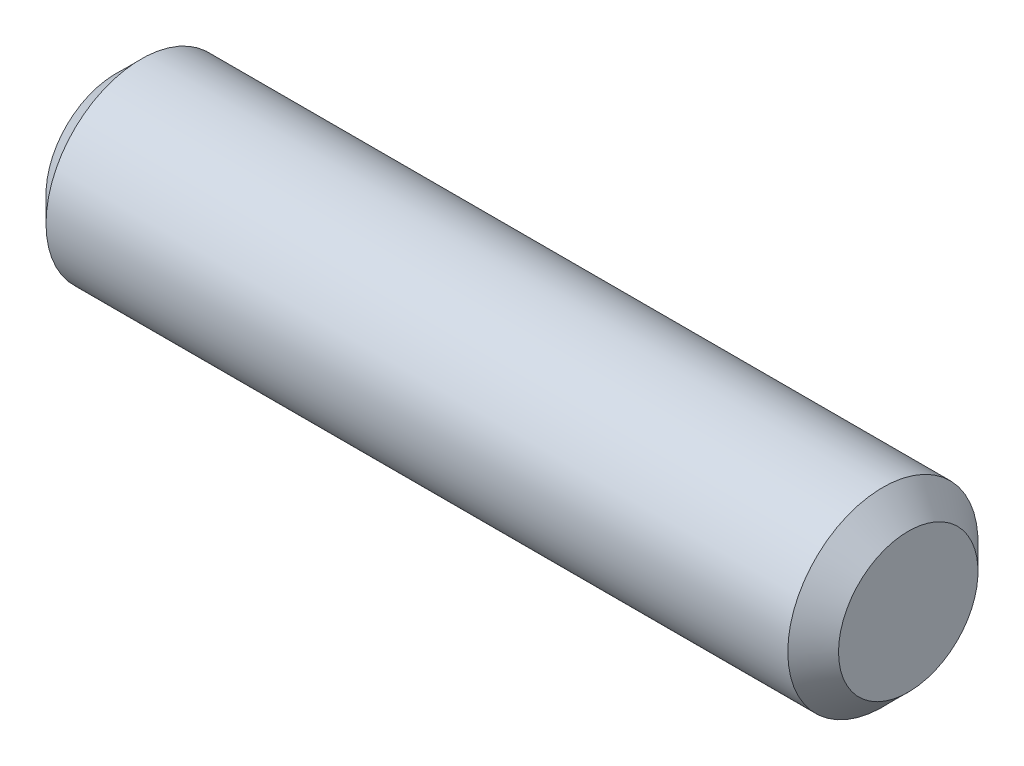
ISO-10303-21;
HEADER;
FILE_DESCRIPTION(('STEP AP214'),'2;1');
FILE_NAME('part.step','',(''),(''),'','','');
FILE_SCHEMA(('AUTOMOTIVE_DESIGN { 1 0 10303 214 1 1 1 1 }'));
ENDSEC;
DATA;
#1=APPLICATION_CONTEXT('core data for automotive mechanical design processes');
#2=APPLICATION_PROTOCOL_DEFINITION('international standard','automotive_design',2000,#1);
#3=PRODUCT_CONTEXT('',#1,'mechanical');
#4=PRODUCT('Part','Part','',(#3));
#5=PRODUCT_RELATED_PRODUCT_CATEGORY('part','',(#4));
#6=PRODUCT_DEFINITION_FORMATION('','',#4);
#7=PRODUCT_DEFINITION_CONTEXT('part definition',#1,'design');
#8=PRODUCT_DEFINITION('design','',#6,#7);
#9=PRODUCT_DEFINITION_SHAPE('','',#8);
#10=(LENGTH_UNIT() NAMED_UNIT(*) SI_UNIT(.MILLI.,.METRE.));
#11=(NAMED_UNIT(*) PLANE_ANGLE_UNIT() SI_UNIT($,.RADIAN.));
#12=(NAMED_UNIT(*) SI_UNIT($,.STERADIAN.) SOLID_ANGLE_UNIT());
#13=UNCERTAINTY_MEASURE_WITH_UNIT(LENGTH_MEASURE(1.E-05),#10,'distance_accuracy_value','');
#14=(GEOMETRIC_REPRESENTATION_CONTEXT(3) GLOBAL_UNCERTAINTY_ASSIGNED_CONTEXT((#13)) GLOBAL_UNIT_ASSIGNED_CONTEXT((#10,
#11,#12)) REPRESENTATION_CONTEXT('',''));
#15=CARTESIAN_POINT('',(0.,0.,0.));
#16=DIRECTION('',(0.,0.,1.));
#17=DIRECTION('',(1.,0.,0.));
#18=AXIS2_PLACEMENT_3D('',#15,#16,#17);
#19=CARTESIAN_POINT('',(-5.34269662921348,0.,0.));
#20=DIRECTION('',(1.,0.,0.));
#21=DIRECTION('',(0.,0.,-1.));
#22=AXIS2_PLACEMENT_3D('',#19,#20,#21);
#23=PLANE('',#22);
#24=CARTESIAN_POINT('',(-5.34269662921348,0.,0.));
#25=DIRECTION('',(1.,0.,0.));
#26=DIRECTION('',(0.,0.,-1.));
#27=AXIS2_PLACEMENT_3D('',#24,#25,#26);
#28=CIRCLE('',#27,2.2);
#29=CARTESIAN_POINT('',(-5.34269662921348,0.,-2.2));
#30=VERTEX_POINT('',#29);
#31=EDGE_CURVE('E49',#30,#30,#28,.F.);
#32=ORIENTED_EDGE('',*,*,#31,.T.);
#33=EDGE_LOOP('',(#32));
#34=FACE_BOUND('',#33,.T.);
#35=ADVANCED_FACE('F34',(#34),#23,.F.);
#36=CARTESIAN_POINT('',(-6.32022471910112,0.,0.));
#37=DIRECTION('',(-1.,0.,0.));
#38=DIRECTION('',(0.,0.,1.));
#39=AXIS2_PLACEMENT_3D('',#36,#37,#38);
#40=CYLINDRICAL_SURFACE('',#39,3.);
#41=CARTESIAN_POINT('',(-4.54269662921348,0.,0.));
#42=DIRECTION('',(1.,0.,0.));
#43=DIRECTION('',(0.,0.,-1.));
#44=AXIS2_PLACEMENT_3D('',#41,#42,#43);
#45=CIRCLE('',#44,3.);
#46=CARTESIAN_POINT('',(-4.54269662921348,0.,-3.));
#47=VERTEX_POINT('',#46);
#48=EDGE_CURVE('E41',#47,#47,#45,.T.);
#49=ORIENTED_EDGE('',*,*,#48,.T.);
#50=EDGE_LOOP('',(#49));
#51=FACE_BOUND('',#50,.T.);
#52=CARTESIAN_POINT('',(18.8573033707865,0.,0.));
#53=DIRECTION('',(-1.,0.,0.));
#54=DIRECTION('',(0.,0.,1.));
#55=AXIS2_PLACEMENT_3D('',#52,#53,#54);
#56=CIRCLE('',#55,3.);
#57=CARTESIAN_POINT('',(18.8573033707865,0.,3.));
#58=VERTEX_POINT('',#57);
#59=EDGE_CURVE('E45',#58,#58,#56,.T.);
#60=ORIENTED_EDGE('',*,*,#59,.T.);
#61=EDGE_LOOP('',(#60));
#62=FACE_BOUND('',#61,.T.);
#63=ADVANCED_FACE('F65',(#51,#62),#40,.T.);
#64=CARTESIAN_POINT('',(19.6573033707865,3.,0.));
#65=DIRECTION('',(-1.,0.,0.));
#66=DIRECTION('',(0.,0.,1.));
#67=AXIS2_PLACEMENT_3D('',#64,#65,#66);
#68=PLANE('',#67);
#69=CARTESIAN_POINT('',(19.6573033707865,0.,0.));
#70=DIRECTION('',(-1.,0.,0.));
#71=DIRECTION('',(0.,0.,1.));
#72=AXIS2_PLACEMENT_3D('',#69,#70,#71);
#73=CIRCLE('',#72,2.19999999999999);
#74=CARTESIAN_POINT('',(19.6573033707865,0.,2.19999999999999));
#75=VERTEX_POINT('',#74);
#76=EDGE_CURVE('E10',#75,#75,#73,.F.);
#77=ORIENTED_EDGE('',*,*,#76,.T.);
#78=EDGE_LOOP('',(#77));
#79=FACE_BOUND('',#78,.T.);
#80=ADVANCED_FACE('F58',(#79),#68,.F.);
#81=CARTESIAN_POINT('',(-5.34269662921348,0.,0.));
#82=DIRECTION('',(1.,0.,0.));
#83=DIRECTION('',(0.,0.,-1.));
#84=AXIS2_PLACEMENT_3D('',#81,#82,#83);
#85=CONICAL_SURFACE('',#84,2.2,0.785398163397447);
#86=ORIENTED_EDGE('',*,*,#48,.F.);
#87=EDGE_LOOP('',(#86));
#88=FACE_BOUND('',#87,.T.);
#89=ORIENTED_EDGE('',*,*,#31,.F.);
#90=EDGE_LOOP('',(#89));
#91=FACE_BOUND('',#90,.T.);
#92=ADVANCED_FACE('F56',(#88,#91),#85,.T.);
#93=CARTESIAN_POINT('',(18.8573033707865,0.,0.));
#94=DIRECTION('',(-1.,0.,0.));
#95=DIRECTION('',(0.,0.,1.));
#96=AXIS2_PLACEMENT_3D('',#93,#94,#95);
#97=CONICAL_SURFACE('',#96,3.,0.785398163397449);
#98=ORIENTED_EDGE('',*,*,#76,.F.);
#99=EDGE_LOOP('',(#98));
#100=FACE_BOUND('',#99,.T.);
#101=ORIENTED_EDGE('',*,*,#59,.F.);
#102=EDGE_LOOP('',(#101));
#103=FACE_BOUND('',#102,.T.);
#104=ADVANCED_FACE('F36',(#100,#103),#97,.T.);
#105=CLOSED_SHELL('',(#35,#63,#80,#92,#104));
#106=MANIFOLD_SOLID_BREP('B2',#105);
#107=ADVANCED_BREP_SHAPE_REPRESENTATION('',(#18,#106),#14);
#108=SHAPE_DEFINITION_REPRESENTATION(#9,#107);
ENDSEC;
END-ISO-10303-21;
